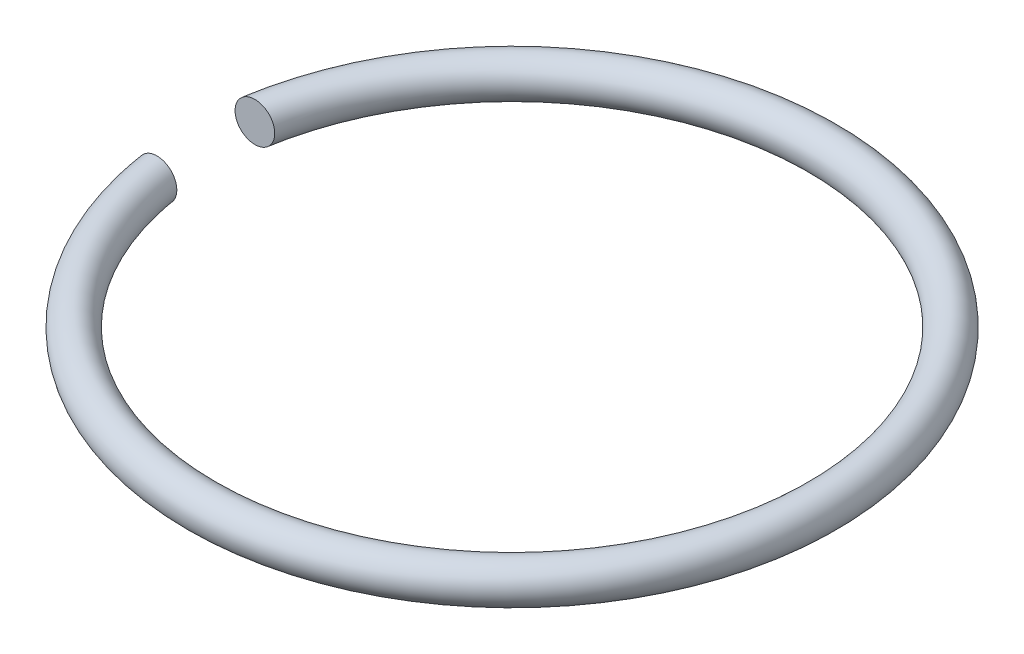
ISO-10303-21;
HEADER;
FILE_DESCRIPTION(('STEP AP214'),'2;1');
FILE_NAME('part.step','',(''),(''),'','','');
FILE_SCHEMA(('AUTOMOTIVE_DESIGN { 1 0 10303 214 1 1 1 1 }'));
ENDSEC;
DATA;
#1=APPLICATION_CONTEXT('core data for automotive mechanical design processes');
#2=APPLICATION_PROTOCOL_DEFINITION('international standard','automotive_design',2000,#1);
#3=PRODUCT_CONTEXT('',#1,'mechanical');
#4=PRODUCT('Part','Part','',(#3));
#5=PRODUCT_RELATED_PRODUCT_CATEGORY('part','',(#4));
#6=PRODUCT_DEFINITION_FORMATION('','',#4);
#7=PRODUCT_DEFINITION_CONTEXT('part definition',#1,'design');
#8=PRODUCT_DEFINITION('design','',#6,#7);
#9=PRODUCT_DEFINITION_SHAPE('','',#8);
#10=(LENGTH_UNIT() NAMED_UNIT(*) SI_UNIT(.MILLI.,.METRE.));
#11=(NAMED_UNIT(*) PLANE_ANGLE_UNIT() SI_UNIT($,.RADIAN.));
#12=(NAMED_UNIT(*) SI_UNIT($,.STERADIAN.) SOLID_ANGLE_UNIT());
#13=UNCERTAINTY_MEASURE_WITH_UNIT(LENGTH_MEASURE(1.E-05),#10,'distance_accuracy_value','');
#14=(GEOMETRIC_REPRESENTATION_CONTEXT(3) GLOBAL_UNCERTAINTY_ASSIGNED_CONTEXT((#13)) GLOBAL_UNIT_ASSIGNED_CONTEXT((#10,
#11,#12)) REPRESENTATION_CONTEXT('',''));
#15=CARTESIAN_POINT('',(0.,0.,0.));
#16=DIRECTION('',(0.,0.,1.));
#17=DIRECTION('',(1.,0.,0.));
#18=AXIS2_PLACEMENT_3D('',#15,#16,#17);
#19=CARTESIAN_POINT('',(0.,0.,0.));
#20=DIRECTION('',(0.,-1.,0.));
#21=DIRECTION('',(0.,0.,-1.));
#22=AXIS2_PLACEMENT_3D('',#19,#20,#21);
#23=TOROIDAL_SURFACE('',#22,9.5,0.6);
#24=CARTESIAN_POINT('',(-9.90918934467898,-0.295694588418098,1.5));
#25=CARTESIAN_POINT('',(-9.89235176297286,-0.325084884106954,1.5));
#26=CARTESIAN_POINT('',(-9.87299806537925,-0.353064009952844,1.5));
#27=CARTESIAN_POINT('',(-9.82983776787072,-0.405386688377729,1.5));
#28=CARTESIAN_POINT('',(-9.8060253157122,-0.429725386394075,1.5));
#29=CARTESIAN_POINT('',(-9.75468320221522,-0.474049548580785,1.5));
#30=CARTESIAN_POINT('',(-9.72715713604399,-0.494039174804915,1.5));
#31=CARTESIAN_POINT('',(-9.6691715035482,-0.529152386603416,1.5));
#32=CARTESIAN_POINT('',(-9.63871265399831,-0.544277157249969,1.5));
#33=CARTESIAN_POINT('',(-9.57544495495714,-0.569381697490342,1.5));
#34=CARTESIAN_POINT('',(-9.54261840053594,-0.579316846333761,1.5));
#35=CARTESIAN_POINT('',(-9.47576880604907,-0.593591583199508,1.5));
#36=CARTESIAN_POINT('',(-9.44174565010229,-0.597930627743449,1.5));
#37=CARTESIAN_POINT('',(-9.373136684303,-0.600918077224366,1.5));
#38=CARTESIAN_POINT('',(-9.33854857626074,-0.599513898799929,1.5));
#39=CARTESIAN_POINT('',(-9.27009432910497,-0.590936971880836,1.5));
#40=CARTESIAN_POINT('',(-9.23622821040076,-0.583764060536236,1.5));
#41=CARTESIAN_POINT('',(-9.17008270539161,-0.563812620001006,1.5));
#42=CARTESIAN_POINT('',(-9.13780811180835,-0.551018187267294,1.5));
#43=CARTESIAN_POINT('',(-9.07588127963409,-0.520163574858099,1.5));
#44=CARTESIAN_POINT('',(-9.04622899087471,-0.502103495950254,1.5));
#45=CARTESIAN_POINT('',(-8.99057485078488,-0.461323184437788,1.5));
#46=CARTESIAN_POINT('',(-8.96455370578505,-0.438629294588949,1.5));
#47=CARTESIAN_POINT('',(-8.91674848738194,-0.389146725096677,1.5));
#48=CARTESIAN_POINT('',(-8.89496414913901,-0.362358301586586,1.5));
#49=CARTESIAN_POINT('',(-8.85653872269795,-0.305792569390791,1.5));
#50=CARTESIAN_POINT('',(-8.83983834203544,-0.276055544304358,1.5));
#51=CARTESIAN_POINT('',(-8.81174427760562,-0.214172183704338,1.5));
#52=CARTESIAN_POINT('',(-8.80035016448414,-0.182026043367625,1.5));
#53=CARTESIAN_POINT('',(-8.78334153808978,-0.116692967203398,1.5));
#54=CARTESIAN_POINT('',(-8.7776527930337,-0.0835253456357243,1.5));
#55=CARTESIAN_POINT('',(-8.7719711356941,-0.0167063948460827,1.5));
#56=CARTESIAN_POINT('',(-8.77197791797762,0.0169449083408046,1.5));
#57=CARTESIAN_POINT('',(-8.77766493790006,0.0835094687964623,1.5));
#58=CARTESIAN_POINT('',(-8.78330273201153,0.116426364080587,1.5));
#59=CARTESIAN_POINT('',(-8.80001366357416,0.180849193840094,1.5));
#60=CARTESIAN_POINT('',(-8.81108679398344,0.21235513014342,1.5));
#61=CARTESIAN_POINT('',(-8.83836058382412,0.273142019148991,1.5));
#62=CARTESIAN_POINT('',(-8.85457205149317,0.302418119021929,1.5));
#63=CARTESIAN_POINT('',(-8.89163142415598,0.357870590403536,1.5));
#64=CARTESIAN_POINT('',(-8.91247954872469,0.384046815023558,1.5));
#65=CARTESIAN_POINT('',(-8.95844742748405,0.432855583958319,1.5));
#66=CARTESIAN_POINT('',(-8.98360966937988,0.455448104048551,1.5));
#67=CARTESIAN_POINT('',(-9.03732650446846,0.496155884119104,1.5));
#68=CARTESIAN_POINT('',(-9.06588133703641,0.514270827891459,1.5));
#69=CARTESIAN_POINT('',(-9.1259860290483,0.545764191670517,1.5));
#70=CARTESIAN_POINT('',(-9.15757106726948,0.559075484518403,1.5));
#71=CARTESIAN_POINT('',(-9.22251358665197,0.580267017721946,1.5));
#72=CARTESIAN_POINT('',(-9.25587117765544,0.588146921079717,1.5));
#73=CARTESIAN_POINT('',(-9.32377333984034,0.598319780222818,1.5));
#74=CARTESIAN_POINT('',(-9.35832649571296,0.600555515213395,1.5));
#75=CARTESIAN_POINT('',(-9.42732018269063,0.599210756917954,1.5));
#76=CARTESIAN_POINT('',(-9.46176071098704,0.595630119677225,1.5));
#77=CARTESIAN_POINT('',(-9.52963894921905,0.582725252633476,1.5));
#78=CARTESIAN_POINT('',(-9.56307394014596,0.573386702263538,1.5));
#79=CARTESIAN_POINT('',(-9.62788817744456,0.549198123642461,1.5));
#80=CARTESIAN_POINT('',(-9.65926746021191,0.534348192999649,1.5));
#81=CARTESIAN_POINT('',(-9.71888603754249,0.499634653744909,1.5));
#82=CARTESIAN_POINT('',(-9.74714177509833,0.479799296221027,1.5));
#83=CARTESIAN_POINT('',(-9.79987643807874,0.435619161024928,1.5));
#84=CARTESIAN_POINT('',(-9.82435556144957,0.411274619842909,1.5));
#85=CARTESIAN_POINT('',(-9.8685625613346,0.359041256857114,1.5));
#86=CARTESIAN_POINT('',(-9.88833800487401,0.331192695925897,1.5));
#87=CARTESIAN_POINT('',(-9.92287054540973,0.272542053038267,1.5));
#88=CARTESIAN_POINT('',(-9.9376281631205,0.241740277971054,1.5));
#89=CARTESIAN_POINT('',(-9.96153974869585,0.178426277146216,1.5));
#90=CARTESIAN_POINT('',(-9.97075428494011,0.145936917000195,1.5));
#91=CARTESIAN_POINT('',(-9.98355604508848,0.0798586714918838,1.5));
#92=CARTESIAN_POINT('',(-9.98714210315785,0.0462695598069422,1.5));
#93=CARTESIAN_POINT('',(-9.98857020053317,-0.0208026217771383,1.5));
#94=CARTESIAN_POINT('',(-9.98645030502865,-0.0542849099009689,1.5));
#95=CARTESIAN_POINT('',(-9.9766111991367,-0.120386917499048,1.5));
#96=CARTESIAN_POINT('',(-9.96889896460701,-0.153007659170969,1.5));
#97=CARTESIAN_POINT('',(-9.95221301581451,-0.204004043732796,1.5));
#98=CARTESIAN_POINT('',(-9.94492144392829,-0.222947176612434,1.5));
#99=CARTESIAN_POINT('',(-9.92845036811902,-0.259993702504052,1.5));
#100=CARTESIAN_POINT('',(-9.9192708746347,-0.278097100158434,1.5));
#101=CARTESIAN_POINT('',(-9.90918934467898,-0.295694588418098,1.5));
#102=B_SPLINE_CURVE_WITH_KNOTS('',3,(#24,#25,#26,#27,#28,#29,#30,#31,#32,#33,#34,#35,#36,#37,
#38,#39,#40,#41,#42,#43,#44,#45,#46,#47,#48,#49,#50,#51,#52,#53,#54,#55,#56,#57,#58,#59,#60,#61,
#62,#63,#64,#65,#66,#67,#68,#69,#70,#71,#72,#73,#74,#75,#76,#77,#78,#79,#80,#81,#82,#83,#84,#85,
#86,#87,#88,#89,#90,#91,#92,#93,#94,#95,#96,#97,#98,#99,#100,#101),.UNSPECIFIED.,.T.,.F.,(4,2,2,
2,2,2,2,2,2,2,2,2,2,2,2,2,2,2,2,2,2,2,2,2,2,2,2,2,2,2,2,2,2,2,2,2,2,2,4),(0.,0.101540104471026,
0.203214429525217,0.30479102021172,0.406342848206607,0.508754021600642,0.611175140139748,
0.714536087451958,0.817899952721275,0.921558141137248,1.02521434599701,1.12829690947454,
1.23137302726472,1.33319637177963,1.43501147587413,1.53548398875674,1.6359511136195,
1.73566664341899,1.83538204402998,1.93530859876743,2.03523988666573,2.1362187355129,
2.23720471348467,2.33955173397394,2.44190510415061,2.54529204378119,2.64868154226858,
2.75232922494755,2.85597507208014,2.95904633003675,3.0621121838125,3.16408665278553,
3.2660505363378,3.36687902286916,3.4677283913943,3.56790665043484,3.66796016207542,
3.72875780408996,3.78955510995006),.UNSPECIFIED.);
#103=CARTESIAN_POINT('',(-9.90918934467898,-0.295694588418098,1.5));
#104=VERTEX_POINT('',#103);
#105=EDGE_CURVE('E48',#104,#104,#102,.T.);
#106=ORIENTED_EDGE('',*,*,#105,.T.);
#107=EDGE_LOOP('',(#106));
#108=FACE_BOUND('',#107,.T.);
#109=CARTESIAN_POINT('',(-9.90918934467898,-0.295694588418098,-1.5));
#110=CARTESIAN_POINT('',(-9.92579979762233,-0.266694663466785,-1.5));
#111=CARTESIAN_POINT('',(-9.93998506099733,-0.236279144917442,-1.5));
#112=CARTESIAN_POINT('',(-9.96306337297348,-0.173475454137592,-1.5));
#113=CARTESIAN_POINT('',(-9.97195061453031,-0.141085160088875,-1.5));
#114=CARTESIAN_POINT('',(-9.9841479591284,-0.0752761991183647,-1.5));
#115=CARTESIAN_POINT('',(-9.98745951434027,-0.041857802272424,-1.5));
#116=CARTESIAN_POINT('',(-9.9884070471431,0.0250509821326235,-1.5));
#117=CARTESIAN_POINT('',(-9.98604434349421,0.0585413511571749,-1.5));
#118=CARTESIAN_POINT('',(-9.97573153863154,0.12456344275426,-1.5));
#119=CARTESIAN_POINT('',(-9.96779551311539,0.157097365680653,-1.5));
#120=CARTESIAN_POINT('',(-9.94658893582143,0.220377714485177,-1.5));
#121=CARTESIAN_POINT('',(-9.9333181773479,0.25112407105071,-1.5));
#122=CARTESIAN_POINT('',(-9.90179048513171,0.310056282108592,-1.5));
#123=CARTESIAN_POINT('',(-9.88351941275412,0.338234569470686,-1.5));
#124=CARTESIAN_POINT('',(-9.84254378907404,0.391157357275991,-1.5));
#125=CARTESIAN_POINT('',(-9.81983907647703,0.415901732738458,-1.5));
#126=CARTESIAN_POINT('',(-9.77043587495346,0.461488080998418,-1.5));
#127=CARTESIAN_POINT('',(-9.74370456031879,0.482294472591357,-1.5));
#128=CARTESIAN_POINT('',(-9.68716077214321,0.519183305286885,-1.5));
#129=CARTESIAN_POINT('',(-9.65734812448921,0.535265479246437,-1.5));
#130=CARTESIAN_POINT('',(-9.59512742357177,0.562441018106362,-1.5));
#131=CARTESIAN_POINT('',(-9.56269384427681,0.573475942770253,-1.5));
#132=CARTESIAN_POINT('',(-9.49644372657044,0.590002231057013,-1.5));
#133=CARTESIAN_POINT('',(-9.46262710663074,0.595493267383931,-1.5));
#134=CARTESIAN_POINT('',(-9.39422360220229,0.600819479620812,-1.5));
#135=CARTESIAN_POINT('',(-9.35963243885431,0.60059981221719,-1.5));
#136=CARTESIAN_POINT('',(-9.29097308668583,0.594379477896506,-1.5));
#137=CARTESIAN_POINT('',(-9.25690491527294,0.588378618976408,-1.5));
#138=CARTESIAN_POINT('',(-9.19013196776455,0.570724181478461,-1.5));
#139=CARTESIAN_POINT('',(-9.1574326021009,0.559050119448001,-1.5));
#140=CARTESIAN_POINT('',(-9.09447046748701,0.530353125015471,-1.5));
#141=CARTESIAN_POINT('',(-9.06420767020454,0.513330254820198,-1.5));
#142=CARTESIAN_POINT('',(-9.00714030700244,0.474489309227562,-1.5));
#143=CARTESIAN_POINT('',(-8.98032019586097,0.452694084949577,-1.5));
#144=CARTESIAN_POINT('',(-8.93077351385033,0.404861947360151,-1.5));
#145=CARTESIAN_POINT('',(-8.90804669792698,0.378825288149447,-1.5));
#146=CARTESIAN_POINT('',(-8.86762151590915,0.32357081999775,-1.5));
#147=CARTESIAN_POINT('',(-8.84986750922209,0.294393726237614,-1.5));
#148=CARTESIAN_POINT('',(-8.81958735056502,0.233442119241933,-1.5));
#149=CARTESIAN_POINT('',(-8.80706077653348,0.201667815952216,-1.5));
#150=CARTESIAN_POINT('',(-8.78776108419907,0.13688186369965,-1.5));
#151=CARTESIAN_POINT('',(-8.78091310348694,0.103892506490752,-1.5));
#152=CARTESIAN_POINT('',(-8.77290461740382,0.0372310748749337,-1.5));
#153=CARTESIAN_POINT('',(-8.77174378048757,0.00355904038118952,-1.5));
#154=CARTESIAN_POINT('',(-8.77513120596553,-0.0632142654133759,-1.5));
#155=CARTESIAN_POINT('',(-8.7796320585354,-0.096317954587314,-1.5));
#156=CARTESIAN_POINT('',(-8.79412230073816,-0.161300444207012,-1.5));
#157=CARTESIAN_POINT('',(-8.80411165470911,-0.193179252610087,-1.5));
#158=CARTESIAN_POINT('',(-8.82928764280445,-0.254853411131766,-1.5));
#159=CARTESIAN_POINT('',(-8.84448001150296,-0.284646418532229,-1.5));
#160=CARTESIAN_POINT('',(-8.87960433423301,-0.341292361871657,-1.5));
#161=CARTESIAN_POINT('',(-8.8995364883295,-0.368145173635936,-1.5));
#162=CARTESIAN_POINT('',(-8.94377610154994,-0.418437180572199,-1.5));
#163=CARTESIAN_POINT('',(-8.96812462946735,-0.441840239415841,-1.5));
#164=CARTESIAN_POINT('',(-9.02035950331156,-0.484292525192654,-1.5));
#165=CARTESIAN_POINT('',(-9.04824610264033,-0.503341440001462,-1.5));
#166=CARTESIAN_POINT('',(-9.10716851374812,-0.536814344397623,-1.5));
#167=CARTESIAN_POINT('',(-9.13824169473145,-0.551172560528149,-1.5));
#168=CARTESIAN_POINT('',(-9.20234055387563,-0.574531797705833,-1.5));
#169=CARTESIAN_POINT('',(-9.23536636015628,-0.583532466792449,-1.5));
#170=CARTESIAN_POINT('',(-9.30281280468173,-0.596007648736926,-1.5));
#171=CARTESIAN_POINT('',(-9.33724459373376,-0.59942194111716,-1.5));
#172=CARTESIAN_POINT('',(-9.40619363659807,-0.600443111619268,-1.5));
#173=CARTESIAN_POINT('',(-9.44071088972766,-0.598050035982057,-1.5));
#174=CARTESIAN_POINT('',(-9.5089686896211,-0.587497336096796,-1.5));
#175=CARTESIAN_POINT('',(-9.54270634185045,-0.579318963388803,-1.5));
#176=CARTESIAN_POINT('',(-9.60832816992213,-0.557384441506258,-1.5));
#177=CARTESIAN_POINT('',(-9.64021191396521,-0.543626998796869,-1.5));
#178=CARTESIAN_POINT('',(-9.70105202482917,-0.510978629415401,-1.5));
#179=CARTESIAN_POINT('',(-9.73002047990233,-0.492110209457543,-1.5));
#180=CARTESIAN_POINT('',(-9.78430796308976,-0.449742434304425,-1.5));
#181=CARTESIAN_POINT('',(-9.80963153425368,-0.426248931958808,-1.5));
#182=CARTESIAN_POINT('',(-9.84734504955158,-0.384717731133374,-1.5));
#183=CARTESIAN_POINT('',(-9.86106049347548,-0.367863520972192,-1.5));
#184=CARTESIAN_POINT('',(-9.88658812197516,-0.33277014060214,-1.5));
#185=CARTESIAN_POINT('',(-9.89840031773631,-0.314530978533545,-1.5));
#186=CARTESIAN_POINT('',(-9.90918934467898,-0.295694588418098,-1.5));
#187=B_SPLINE_CURVE_WITH_KNOTS('',3,(#109,#110,#111,#112,#113,#114,#115,#116,#117,#118,#119,
#120,#121,#122,#123,#124,#125,#126,#127,#128,#129,#130,#131,#132,#133,#134,#135,#136,#137,#138,
#139,#140,#141,#142,#143,#144,#145,#146,#147,#148,#149,#150,#151,#152,#153,#154,#155,#156,#157,
#158,#159,#160,#161,#162,#163,#164,#165,#166,#167,#168,#169,#170,#171,#172,#173,#174,#175,#176,
#177,#178,#179,#180,#181,#182,#183,#184,#185,#186),.UNSPECIFIED.,.T.,.F.,(4,2,2,2,2,2,2,2,2,2,2,
2,2,2,2,2,2,2,2,2,2,2,2,2,2,2,2,2,2,2,2,2,2,2,2,2,2,2,4),(0.,0.100181680637411,
0.200472967258703,0.3007381292755,0.400979990820998,0.500969592841044,0.60096306935966,
0.701242256851553,0.801525093150626,0.902674773533091,1.00383017258381,1.1061288763849,
1.20843361926758,1.31172121571921,1.41501224264288,1.51867901065102,1.62234457305621,
1.72552421239955,1.82869767261076,1.93066586618727,2.03262582528533,2.13321923159418,
2.23380677350723,2.33355759547845,2.43330776931889,2.53316823989792,2.63303292630649,
2.73387892075839,2.83473214203307,2.93694423819969,3.03916304838211,3.14247667440523,
3.24578947780079,3.34943863082016,3.4531118291579,3.55633571217585,3.65942979972543,
3.72450142707565,3.78957267198665),.UNSPECIFIED.);
#188=CARTESIAN_POINT('',(-9.90918934467898,-0.295694588418098,-1.5));
#189=VERTEX_POINT('',#188);
#190=EDGE_CURVE('E10',#189,#189,#187,.T.);
#191=ORIENTED_EDGE('',*,*,#190,.T.);
#192=EDGE_LOOP('',(#191));
#193=FACE_BOUND('',#192,.T.);
#194=ADVANCED_FACE('F37',(#108,#193),#23,.T.);
#195=CARTESIAN_POINT('',(-12.1619974968585,-0.6,1.5));
#196=DIRECTION('',(0.,0.,1.));
#197=DIRECTION('',(1.,0.,0.));
#198=AXIS2_PLACEMENT_3D('',#195,#196,#197);
#199=PLANE('',#198);
#200=ORIENTED_EDGE('',*,*,#105,.F.);
#201=EDGE_LOOP('',(#200));
#202=FACE_BOUND('',#201,.T.);
#203=ADVANCED_FACE('F57',(#202),#199,.F.);
#204=CARTESIAN_POINT('',(-12.1619974968585,-0.6,-1.5));
#205=DIRECTION('',(0.,0.,-1.));
#206=DIRECTION('',(-1.,0.,0.));
#207=AXIS2_PLACEMENT_3D('',#204,#205,#206);
#208=PLANE('',#207);
#209=ORIENTED_EDGE('',*,*,#190,.F.);
#210=EDGE_LOOP('',(#209));
#211=FACE_BOUND('',#210,.T.);
#212=ADVANCED_FACE('F60',(#211),#208,.F.);
#213=CLOSED_SHELL('',(#194,#203,#212));
#214=MANIFOLD_SOLID_BREP('B2',#213);
#215=ADVANCED_BREP_SHAPE_REPRESENTATION('',(#18,#214),#14);
#216=SHAPE_DEFINITION_REPRESENTATION(#9,#215);
ENDSEC;
END-ISO-10303-21;
